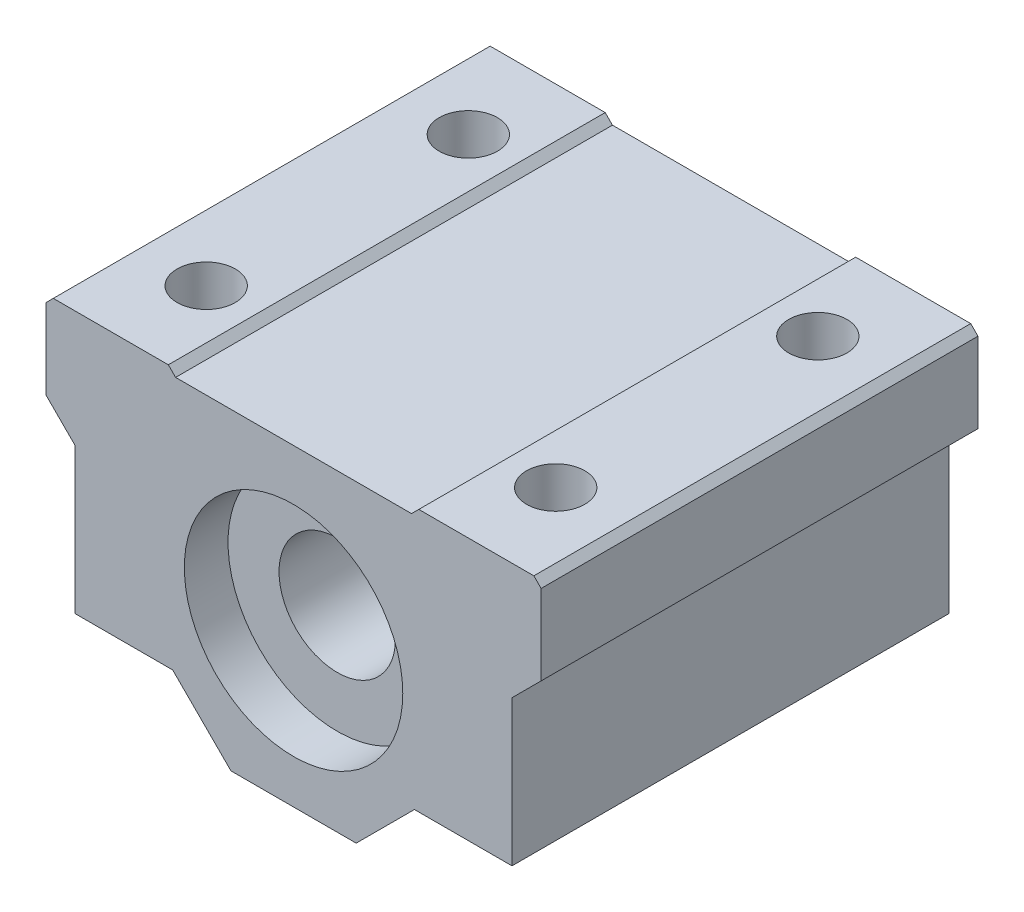
ISO-10303-21;
HEADER;
FILE_DESCRIPTION(('STEP AP214'),'2;1');
FILE_NAME('part.step','',(''),(''),'','','');
FILE_SCHEMA(('AUTOMOTIVE_DESIGN { 1 0 10303 214 1 1 1 1 }'));
ENDSEC;
DATA;
#1=APPLICATION_CONTEXT('core data for automotive mechanical design processes');
#2=APPLICATION_PROTOCOL_DEFINITION('international standard','automotive_design',2000,#1);
#3=PRODUCT_CONTEXT('',#1,'mechanical');
#4=PRODUCT('Part','Part','',(#3));
#5=PRODUCT_RELATED_PRODUCT_CATEGORY('part','',(#4));
#6=PRODUCT_DEFINITION_FORMATION('','',#4);
#7=PRODUCT_DEFINITION_CONTEXT('part definition',#1,'design');
#8=PRODUCT_DEFINITION('design','',#6,#7);
#9=PRODUCT_DEFINITION_SHAPE('','',#8);
#10=(LENGTH_UNIT() NAMED_UNIT(*) SI_UNIT(.MILLI.,.METRE.));
#11=(NAMED_UNIT(*) PLANE_ANGLE_UNIT() SI_UNIT($,.RADIAN.));
#12=(NAMED_UNIT(*) SI_UNIT($,.STERADIAN.) SOLID_ANGLE_UNIT());
#13=UNCERTAINTY_MEASURE_WITH_UNIT(LENGTH_MEASURE(1.E-05),#10,'distance_accuracy_value','');
#14=(GEOMETRIC_REPRESENTATION_CONTEXT(3) GLOBAL_UNCERTAINTY_ASSIGNED_CONTEXT((#13)) GLOBAL_UNIT_ASSIGNED_CONTEXT((#10,
#11,#12)) REPRESENTATION_CONTEXT('',''));
#15=CARTESIAN_POINT('',(0.,0.,0.));
#16=DIRECTION('',(0.,0.,1.));
#17=DIRECTION('',(1.,0.,0.));
#18=AXIS2_PLACEMENT_3D('',#15,#16,#17);
#19=CARTESIAN_POINT('',(-7.5,76.5,27.));
#20=DIRECTION('',(0.,0.,-1.));
#21=DIRECTION('',(1.,0.,0.));
#22=AXIS2_PLACEMENT_3D('',#19,#20,#21);
#23=PLANE('',#22);
#24=CARTESIAN_POINT('',(0.,69.,27.));
#25=DIRECTION('',(0.,0.,1.));
#26=DIRECTION('',(1.,0.,0.));
#27=AXIS2_PLACEMENT_3D('',#24,#25,#26);
#28=CIRCLE('',#27,4.);
#29=CARTESIAN_POINT('',(4.,69.,27.));
#30=VERTEX_POINT('',#29);
#31=EDGE_CURVE('E352',#30,#30,#28,.F.);
#32=ORIENTED_EDGE('',*,*,#31,.T.);
#33=EDGE_LOOP('',(#32));
#34=FACE_BOUND('',#33,.T.);
#35=CARTESIAN_POINT('',(0.,69.,27.));
#36=DIRECTION('',(0.,0.,1.));
#37=DIRECTION('',(1.,0.,0.));
#38=AXIS2_PLACEMENT_3D('',#35,#36,#37);
#39=CIRCLE('',#38,7.5);
#40=CARTESIAN_POINT('',(7.5,69.,27.));
#41=VERTEX_POINT('',#40);
#42=EDGE_CURVE('E19',#41,#41,#39,.T.);
#43=ORIENTED_EDGE('',*,*,#42,.T.);
#44=EDGE_LOOP('',(#43));
#45=FACE_BOUND('',#44,.T.);
#46=ADVANCED_FACE('F15',(#34,#45),#23,.F.);
#47=CARTESIAN_POINT('',(10.,72.5,8.));
#48=DIRECTION('',(0.,-1.,0.));
#49=DIRECTION('',(0.,0.,-1.));
#50=AXIS2_PLACEMENT_3D('',#47,#48,#49);
#51=PLANE('',#50);
#52=CARTESIAN_POINT('',(12.,72.5,6.));
#53=DIRECTION('',(0.,-1.,0.));
#54=DIRECTION('',(0.,0.,-1.));
#55=AXIS2_PLACEMENT_3D('',#52,#53,#54);
#56=CIRCLE('',#55,1.7);
#57=CARTESIAN_POINT('',(12.,72.5,4.3));
#58=VERTEX_POINT('',#57);
#59=EDGE_CURVE('E339',#58,#58,#56,.T.);
#60=ORIENTED_EDGE('',*,*,#59,.T.);
#61=EDGE_LOOP('',(#60));
#62=FACE_BOUND('',#61,.T.);
#63=CARTESIAN_POINT('',(12.,72.5,6.));
#64=DIRECTION('',(0.,-1.,0.));
#65=DIRECTION('',(0.,0.,-1.));
#66=AXIS2_PLACEMENT_3D('',#63,#64,#65);
#67=CIRCLE('',#66,2.);
#68=CARTESIAN_POINT('',(12.,72.5,4.));
#69=VERTEX_POINT('',#68);
#70=EDGE_CURVE('E348',#69,#69,#67,.F.);
#71=ORIENTED_EDGE('',*,*,#70,.T.);
#72=EDGE_LOOP('',(#71));
#73=FACE_BOUND('',#72,.T.);
#74=ADVANCED_FACE('F813',(#62,#73),#51,.F.);
#75=CARTESIAN_POINT('',(10.,72.5,26.));
#76=DIRECTION('',(0.,-1.,0.));
#77=DIRECTION('',(0.,0.,-1.));
#78=AXIS2_PLACEMENT_3D('',#75,#76,#77);
#79=PLANE('',#78);
#80=CARTESIAN_POINT('',(12.,72.5,24.));
#81=DIRECTION('',(0.,-1.,0.));
#82=DIRECTION('',(0.,0.,-1.));
#83=AXIS2_PLACEMENT_3D('',#80,#81,#82);
#84=CIRCLE('',#83,1.7);
#85=CARTESIAN_POINT('',(12.,72.5,22.3));
#86=VERTEX_POINT('',#85);
#87=EDGE_CURVE('E335',#86,#86,#84,.T.);
#88=ORIENTED_EDGE('',*,*,#87,.T.);
#89=EDGE_LOOP('',(#88));
#90=FACE_BOUND('',#89,.T.);
#91=CARTESIAN_POINT('',(12.,72.5,24.));
#92=DIRECTION('',(0.,-1.,0.));
#93=DIRECTION('',(0.,0.,-1.));
#94=AXIS2_PLACEMENT_3D('',#91,#92,#93);
#95=CIRCLE('',#94,2.);
#96=CARTESIAN_POINT('',(12.,72.5,22.));
#97=VERTEX_POINT('',#96);
#98=EDGE_CURVE('E344',#97,#97,#95,.F.);
#99=ORIENTED_EDGE('',*,*,#98,.T.);
#100=EDGE_LOOP('',(#99));
#101=FACE_BOUND('',#100,.T.);
#102=ADVANCED_FACE('F803',(#90,#101),#79,.F.);
#103=CARTESIAN_POINT('',(-14.,72.5,8.));
#104=DIRECTION('',(0.,-1.,0.));
#105=DIRECTION('',(0.,0.,-1.));
#106=AXIS2_PLACEMENT_3D('',#103,#104,#105);
#107=PLANE('',#106);
#108=CARTESIAN_POINT('',(-12.,72.5,6.));
#109=DIRECTION('',(0.,-1.,0.));
#110=DIRECTION('',(0.,0.,-1.));
#111=AXIS2_PLACEMENT_3D('',#108,#109,#110);
#112=CIRCLE('',#111,1.7);
#113=CARTESIAN_POINT('',(-12.,72.5,4.3));
#114=VERTEX_POINT('',#113);
#115=EDGE_CURVE('E331',#114,#114,#112,.T.);
#116=ORIENTED_EDGE('',*,*,#115,.T.);
#117=EDGE_LOOP('',(#116));
#118=FACE_BOUND('',#117,.T.);
#119=CARTESIAN_POINT('',(-12.,72.5,6.));
#120=DIRECTION('',(0.,-1.,0.));
#121=DIRECTION('',(0.,0.,-1.));
#122=AXIS2_PLACEMENT_3D('',#119,#120,#121);
#123=CIRCLE('',#122,2.);
#124=CARTESIAN_POINT('',(-12.,72.5,4.));
#125=VERTEX_POINT('',#124);
#126=EDGE_CURVE('E322',#125,#125,#123,.F.);
#127=ORIENTED_EDGE('',*,*,#126,.T.);
#128=EDGE_LOOP('',(#127));
#129=FACE_BOUND('',#128,.T.);
#130=ADVANCED_FACE('F793',(#118,#129),#107,.F.);
#131=CARTESIAN_POINT('',(-14.,72.5,26.));
#132=DIRECTION('',(0.,-1.,0.));
#133=DIRECTION('',(0.,0.,-1.));
#134=AXIS2_PLACEMENT_3D('',#131,#132,#133);
#135=PLANE('',#134);
#136=CARTESIAN_POINT('',(-12.,72.5,24.));
#137=DIRECTION('',(0.,-1.,0.));
#138=DIRECTION('',(0.,0.,-1.));
#139=AXIS2_PLACEMENT_3D('',#136,#137,#138);
#140=CIRCLE('',#139,1.7);
#141=CARTESIAN_POINT('',(-12.,72.5,22.3));
#142=VERTEX_POINT('',#141);
#143=EDGE_CURVE('E327',#142,#142,#140,.T.);
#144=ORIENTED_EDGE('',*,*,#143,.T.);
#145=EDGE_LOOP('',(#144));
#146=FACE_BOUND('',#145,.T.);
#147=CARTESIAN_POINT('',(-12.,72.5,24.));
#148=DIRECTION('',(0.,-1.,0.));
#149=DIRECTION('',(0.,0.,-1.));
#150=AXIS2_PLACEMENT_3D('',#147,#148,#149);
#151=CIRCLE('',#150,2.);
#152=CARTESIAN_POINT('',(-12.,72.5,22.));
#153=VERTEX_POINT('',#152);
#154=EDGE_CURVE('E318',#153,#153,#151,.F.);
#155=ORIENTED_EDGE('',*,*,#154,.T.);
#156=EDGE_LOOP('',(#155));
#157=FACE_BOUND('',#156,.T.);
#158=ADVANCED_FACE('F368',(#146,#157),#135,.F.);
#159=CARTESIAN_POINT('',(0.,69.,27.));
#160=DIRECTION('',(0.,0.,1.));
#161=DIRECTION('',(1.,0.,0.));
#162=AXIS2_PLACEMENT_3D('',#159,#160,#161);
#163=CYLINDRICAL_SURFACE('',#162,7.5);
#164=ORIENTED_EDGE('',*,*,#42,.F.);
#165=EDGE_LOOP('',(#164));
#166=FACE_BOUND('',#165,.T.);
#167=CARTESIAN_POINT('',(0.,69.,30.));
#168=DIRECTION('',(0.,0.,1.));
#169=DIRECTION('',(1.,0.,0.));
#170=AXIS2_PLACEMENT_3D('',#167,#168,#169);
#171=CIRCLE('',#170,7.5);
#172=CARTESIAN_POINT('',(7.5,69.,30.));
#173=VERTEX_POINT('',#172);
#174=EDGE_CURVE('E306',#173,#173,#171,.T.);
#175=ORIENTED_EDGE('',*,*,#174,.T.);
#176=EDGE_LOOP('',(#175));
#177=FACE_BOUND('',#176,.T.);
#178=ADVANCED_FACE('F364',(#166,#177),#163,.F.);
#179=CARTESIAN_POINT('',(0.,69.,3.));
#180=DIRECTION('',(0.,0.,1.));
#181=DIRECTION('',(1.,0.,0.));
#182=AXIS2_PLACEMENT_3D('',#179,#180,#181);
#183=CYLINDRICAL_SURFACE('',#182,4.);
#184=ORIENTED_EDGE('',*,*,#31,.F.);
#185=EDGE_LOOP('',(#184));
#186=FACE_BOUND('',#185,.T.);
#187=CARTESIAN_POINT('',(0.,69.,3.));
#188=DIRECTION('',(0.,0.,1.));
#189=DIRECTION('',(1.,0.,0.));
#190=AXIS2_PLACEMENT_3D('',#187,#188,#189);
#191=CIRCLE('',#190,4.);
#192=CARTESIAN_POINT('',(4.,69.,3.));
#193=VERTEX_POINT('',#192);
#194=EDGE_CURVE('E173',#193,#193,#191,.F.);
#195=ORIENTED_EDGE('',*,*,#194,.T.);
#196=EDGE_LOOP('',(#195));
#197=FACE_BOUND('',#196,.T.);
#198=ADVANCED_FACE('F367',(#186,#197),#183,.F.);
#199=CARTESIAN_POINT('',(8.6,80.5,0.));
#200=DIRECTION('',(-0.707106781186547,0.707106781186547,0.));
#201=DIRECTION('',(-0.707106781186547,-0.707106781186547,0.));
#202=AXIS2_PLACEMENT_3D('',#199,#200,#201);
#203=PLANE('',#202);
#204=DIRECTION('',(-0.707106781186547,-0.707106781186547,0.));
#205=VECTOR('',#204,1.);
#206=CARTESIAN_POINT('',(8.6,80.5,30.));
#207=LINE('',#206,#205);
#208=CARTESIAN_POINT('',(8.1,80.,30.));
#209=VERTEX_POINT('',#208);
#210=CARTESIAN_POINT('',(8.6,80.5,30.));
#211=VERTEX_POINT('',#210);
#212=EDGE_CURVE('E144',#209,#211,#207,.F.);
#213=ORIENTED_EDGE('',*,*,#212,.T.);
#214=DIRECTION('',(0.,0.,1.));
#215=VECTOR('',#214,1.);
#216=CARTESIAN_POINT('',(8.6,80.5,15.));
#217=LINE('',#216,#215);
#218=CARTESIAN_POINT('',(8.6,80.5,0.));
#219=VERTEX_POINT('',#218);
#220=EDGE_CURVE('E148',#219,#211,#217,.T.);
#221=ORIENTED_EDGE('',*,*,#220,.F.);
#222=DIRECTION('',(-0.707106781186547,-0.707106781186547,0.));
#223=VECTOR('',#222,1.);
#224=CARTESIAN_POINT('',(8.35,80.25,0.));
#225=LINE('',#224,#223);
#226=CARTESIAN_POINT('',(8.1,80.,0.));
#227=VERTEX_POINT('',#226);
#228=EDGE_CURVE('E351',#219,#227,#225,.T.);
#229=ORIENTED_EDGE('',*,*,#228,.T.);
#230=DIRECTION('',(0.,0.,-1.));
#231=VECTOR('',#230,1.);
#232=CARTESIAN_POINT('',(8.1,80.,15.));
#233=LINE('',#232,#231);
#234=EDGE_CURVE('E150',#209,#227,#233,.T.);
#235=ORIENTED_EDGE('',*,*,#234,.F.);
#236=EDGE_LOOP('',(#213,#221,#229,#235));
#237=FACE_BOUND('',#236,.T.);
#238=ADVANCED_FACE('F146',(#237),#203,.T.);
#239=CARTESIAN_POINT('',(12.,80.5,6.));
#240=DIRECTION('',(0.,-1.,0.));
#241=DIRECTION('',(0.,0.,-1.));
#242=AXIS2_PLACEMENT_3D('',#239,#240,#241);
#243=CYLINDRICAL_SURFACE('',#242,2.);
#244=ORIENTED_EDGE('',*,*,#70,.F.);
#245=EDGE_LOOP('',(#244));
#246=FACE_BOUND('',#245,.T.);
#247=CARTESIAN_POINT('',(12.,80.5,6.));
#248=DIRECTION('',(0.,-1.,0.));
#249=DIRECTION('',(0.,0.,-1.));
#250=AXIS2_PLACEMENT_3D('',#247,#248,#249);
#251=CIRCLE('',#250,2.);
#252=CARTESIAN_POINT('',(12.,80.5,4.));
#253=VERTEX_POINT('',#252);
#254=EDGE_CURVE('E299',#253,#253,#251,.T.);
#255=ORIENTED_EDGE('',*,*,#254,.F.);
#256=EDGE_LOOP('',(#255));
#257=FACE_BOUND('',#256,.T.);
#258=ADVANCED_FACE('F751',(#246,#257),#243,.F.);
#259=CARTESIAN_POINT('',(12.,80.5,24.));
#260=DIRECTION('',(0.,-1.,0.));
#261=DIRECTION('',(0.,0.,-1.));
#262=AXIS2_PLACEMENT_3D('',#259,#260,#261);
#263=CYLINDRICAL_SURFACE('',#262,2.);
#264=ORIENTED_EDGE('',*,*,#98,.F.);
#265=EDGE_LOOP('',(#264));
#266=FACE_BOUND('',#265,.T.);
#267=CARTESIAN_POINT('',(12.,80.5,24.));
#268=DIRECTION('',(0.,-1.,0.));
#269=DIRECTION('',(0.,0.,-1.));
#270=AXIS2_PLACEMENT_3D('',#267,#268,#269);
#271=CIRCLE('',#270,2.);
#272=CARTESIAN_POINT('',(12.,80.5,22.));
#273=VERTEX_POINT('',#272);
#274=EDGE_CURVE('E294',#273,#273,#271,.T.);
#275=ORIENTED_EDGE('',*,*,#274,.F.);
#276=EDGE_LOOP('',(#275));
#277=FACE_BOUND('',#276,.T.);
#278=ADVANCED_FACE('F742',(#266,#277),#263,.F.);
#279=CARTESIAN_POINT('',(17.,80.,0.));
#280=DIRECTION('',(0.707106781186547,0.707106781186547,0.));
#281=DIRECTION('',(-0.707106781186547,0.707106781186547,0.));
#282=AXIS2_PLACEMENT_3D('',#279,#280,#281);
#283=PLANE('',#282);
#284=DIRECTION('',(-0.707106781186547,0.707106781186547,0.));
#285=VECTOR('',#284,1.);
#286=CARTESIAN_POINT('',(17.,80.,30.));
#287=LINE('',#286,#285);
#288=CARTESIAN_POINT('',(16.5,80.5,30.));
#289=VERTEX_POINT('',#288);
#290=CARTESIAN_POINT('',(17.,80.,30.));
#291=VERTEX_POINT('',#290);
#292=EDGE_CURVE('E153',#289,#291,#287,.F.);
#293=ORIENTED_EDGE('',*,*,#292,.T.);
#294=DIRECTION('',(0.,0.,1.));
#295=VECTOR('',#294,1.);
#296=CARTESIAN_POINT('',(17.,80.,15.));
#297=LINE('',#296,#295);
#298=CARTESIAN_POINT('',(17.,80.,0.));
#299=VERTEX_POINT('',#298);
#300=EDGE_CURVE('E298',#299,#291,#297,.T.);
#301=ORIENTED_EDGE('',*,*,#300,.F.);
#302=DIRECTION('',(-0.707106781186547,0.707106781186547,0.));
#303=VECTOR('',#302,1.);
#304=CARTESIAN_POINT('',(16.75,80.25,0.));
#305=LINE('',#304,#303);
#306=CARTESIAN_POINT('',(16.5,80.5,0.));
#307=VERTEX_POINT('',#306);
#308=EDGE_CURVE('E343',#299,#307,#305,.T.);
#309=ORIENTED_EDGE('',*,*,#308,.T.);
#310=DIRECTION('',(0.,0.,-1.));
#311=VECTOR('',#310,1.);
#312=CARTESIAN_POINT('',(16.5,80.5,15.));
#313=LINE('',#312,#311);
#314=EDGE_CURVE('E164',#289,#307,#313,.T.);
#315=ORIENTED_EDGE('',*,*,#314,.F.);
#316=EDGE_LOOP('',(#293,#301,#309,#315));
#317=FACE_BOUND('',#316,.T.);
#318=ADVANCED_FACE('F430',(#317),#283,.T.);
#319=CARTESIAN_POINT('',(12.,72.5,6.));
#320=DIRECTION('',(0.,-1.,0.));
#321=DIRECTION('',(0.,0.,-1.));
#322=AXIS2_PLACEMENT_3D('',#319,#320,#321);
#323=CYLINDRICAL_SURFACE('',#322,1.7);
#324=ORIENTED_EDGE('',*,*,#59,.F.);
#325=EDGE_LOOP('',(#324));
#326=FACE_BOUND('',#325,.T.);
#327=CARTESIAN_POINT('',(12.,62.5,6.));
#328=DIRECTION('',(0.,-1.,0.));
#329=DIRECTION('',(0.,0.,-1.));
#330=AXIS2_PLACEMENT_3D('',#327,#328,#329);
#331=CIRCLE('',#330,1.7);
#332=CARTESIAN_POINT('',(12.,62.5,4.3));
#333=VERTEX_POINT('',#332);
#334=EDGE_CURVE('E289',#333,#333,#331,.F.);
#335=ORIENTED_EDGE('',*,*,#334,.F.);
#336=EDGE_LOOP('',(#335));
#337=FACE_BOUND('',#336,.T.);
#338=ADVANCED_FACE('F723',(#326,#337),#323,.F.);
#339=CARTESIAN_POINT('',(12.,72.5,24.));
#340=DIRECTION('',(0.,-1.,0.));
#341=DIRECTION('',(0.,0.,-1.));
#342=AXIS2_PLACEMENT_3D('',#339,#340,#341);
#343=CYLINDRICAL_SURFACE('',#342,1.7);
#344=ORIENTED_EDGE('',*,*,#87,.F.);
#345=EDGE_LOOP('',(#344));
#346=FACE_BOUND('',#345,.T.);
#347=CARTESIAN_POINT('',(12.,62.5,24.));
#348=DIRECTION('',(0.,-1.,0.));
#349=DIRECTION('',(0.,0.,-1.));
#350=AXIS2_PLACEMENT_3D('',#347,#348,#349);
#351=CIRCLE('',#350,1.7);
#352=CARTESIAN_POINT('',(12.,62.5,22.3));
#353=VERTEX_POINT('',#352);
#354=EDGE_CURVE('E203',#353,#353,#351,.F.);
#355=ORIENTED_EDGE('',*,*,#354,.F.);
#356=EDGE_LOOP('',(#355));
#357=FACE_BOUND('',#356,.T.);
#358=ADVANCED_FACE('F713',(#346,#357),#343,.F.);
#359=CARTESIAN_POINT('',(-12.,72.5,6.));
#360=DIRECTION('',(0.,-1.,0.));
#361=DIRECTION('',(0.,0.,-1.));
#362=AXIS2_PLACEMENT_3D('',#359,#360,#361);
#363=CYLINDRICAL_SURFACE('',#362,1.7);
#364=ORIENTED_EDGE('',*,*,#115,.F.);
#365=EDGE_LOOP('',(#364));
#366=FACE_BOUND('',#365,.T.);
#367=CARTESIAN_POINT('',(-12.,62.5,6.));
#368=DIRECTION('',(0.,-1.,0.));
#369=DIRECTION('',(0.,0.,-1.));
#370=AXIS2_PLACEMENT_3D('',#367,#368,#369);
#371=CIRCLE('',#370,1.7);
#372=CARTESIAN_POINT('',(-12.,62.5,4.3));
#373=VERTEX_POINT('',#372);
#374=EDGE_CURVE('E282',#373,#373,#371,.F.);
#375=ORIENTED_EDGE('',*,*,#374,.F.);
#376=EDGE_LOOP('',(#375));
#377=FACE_BOUND('',#376,.T.);
#378=ADVANCED_FACE('F703',(#366,#377),#363,.F.);
#379=CARTESIAN_POINT('',(-12.,72.5,24.));
#380=DIRECTION('',(0.,-1.,0.));
#381=DIRECTION('',(0.,0.,-1.));
#382=AXIS2_PLACEMENT_3D('',#379,#380,#381);
#383=CYLINDRICAL_SURFACE('',#382,1.7);
#384=ORIENTED_EDGE('',*,*,#143,.F.);
#385=EDGE_LOOP('',(#384));
#386=FACE_BOUND('',#385,.T.);
#387=CARTESIAN_POINT('',(-12.,62.5,24.));
#388=DIRECTION('',(0.,-1.,0.));
#389=DIRECTION('',(0.,0.,-1.));
#390=AXIS2_PLACEMENT_3D('',#387,#388,#389);
#391=CIRCLE('',#390,1.7);
#392=CARTESIAN_POINT('',(-12.,62.5,22.3));
#393=VERTEX_POINT('',#392);
#394=EDGE_CURVE('E277',#393,#393,#391,.F.);
#395=ORIENTED_EDGE('',*,*,#394,.F.);
#396=EDGE_LOOP('',(#395));
#397=FACE_BOUND('',#396,.T.);
#398=ADVANCED_FACE('F694',(#386,#397),#383,.F.);
#399=CARTESIAN_POINT('',(-16.5,80.5,0.));
#400=DIRECTION('',(-0.707106781186547,0.707106781186547,0.));
#401=DIRECTION('',(-0.707106781186547,-0.707106781186547,0.));
#402=AXIS2_PLACEMENT_3D('',#399,#400,#401);
#403=PLANE('',#402);
#404=DIRECTION('',(-0.707106781186547,-0.707106781186547,0.));
#405=VECTOR('',#404,1.);
#406=CARTESIAN_POINT('',(-16.5,80.5,30.));
#407=LINE('',#406,#405);
#408=CARTESIAN_POINT('',(-17.,80.,30.));
#409=VERTEX_POINT('',#408);
#410=CARTESIAN_POINT('',(-16.5,80.5,30.));
#411=VERTEX_POINT('',#410);
#412=EDGE_CURVE('E313',#409,#411,#407,.F.);
#413=ORIENTED_EDGE('',*,*,#412,.T.);
#414=DIRECTION('',(0.,0.,1.));
#415=VECTOR('',#414,1.);
#416=CARTESIAN_POINT('',(-16.5,80.5,15.));
#417=LINE('',#416,#415);
#418=CARTESIAN_POINT('',(-16.5,80.5,0.));
#419=VERTEX_POINT('',#418);
#420=EDGE_CURVE('E411',#419,#411,#417,.T.);
#421=ORIENTED_EDGE('',*,*,#420,.F.);
#422=DIRECTION('',(-0.707106781186547,-0.707106781186547,0.));
#423=VECTOR('',#422,1.);
#424=CARTESIAN_POINT('',(-16.75,80.25,0.));
#425=LINE('',#424,#423);
#426=CARTESIAN_POINT('',(-17.,80.,0.));
#427=VERTEX_POINT('',#426);
#428=EDGE_CURVE('E326',#419,#427,#425,.T.);
#429=ORIENTED_EDGE('',*,*,#428,.T.);
#430=DIRECTION('',(0.,0.,-1.));
#431=VECTOR('',#430,1.);
#432=CARTESIAN_POINT('',(-17.,80.,15.));
#433=LINE('',#432,#431);
#434=EDGE_CURVE('E407',#409,#427,#433,.T.);
#435=ORIENTED_EDGE('',*,*,#434,.F.);
#436=EDGE_LOOP('',(#413,#421,#429,#435));
#437=FACE_BOUND('',#436,.T.);
#438=ADVANCED_FACE('F454',(#437),#403,.T.);
#439=CARTESIAN_POINT('',(-12.,80.5,6.));
#440=DIRECTION('',(0.,-1.,0.));
#441=DIRECTION('',(0.,0.,-1.));
#442=AXIS2_PLACEMENT_3D('',#439,#440,#441);
#443=CYLINDRICAL_SURFACE('',#442,2.);
#444=ORIENTED_EDGE('',*,*,#126,.F.);
#445=EDGE_LOOP('',(#444));
#446=FACE_BOUND('',#445,.T.);
#447=CARTESIAN_POINT('',(-12.,80.5,6.));
#448=DIRECTION('',(0.,-1.,0.));
#449=DIRECTION('',(0.,0.,-1.));
#450=AXIS2_PLACEMENT_3D('',#447,#448,#449);
#451=CIRCLE('',#450,2.);
#452=CARTESIAN_POINT('',(-12.,80.5,4.));
#453=VERTEX_POINT('',#452);
#454=EDGE_CURVE('E272',#453,#453,#451,.T.);
#455=ORIENTED_EDGE('',*,*,#454,.F.);
#456=EDGE_LOOP('',(#455));
#457=FACE_BOUND('',#456,.T.);
#458=ADVANCED_FACE('F675',(#446,#457),#443,.F.);
#459=CARTESIAN_POINT('',(-12.,80.5,24.));
#460=DIRECTION('',(0.,-1.,0.));
#461=DIRECTION('',(0.,0.,-1.));
#462=AXIS2_PLACEMENT_3D('',#459,#460,#461);
#463=CYLINDRICAL_SURFACE('',#462,2.);
#464=ORIENTED_EDGE('',*,*,#154,.F.);
#465=EDGE_LOOP('',(#464));
#466=FACE_BOUND('',#465,.T.);
#467=CARTESIAN_POINT('',(-12.,80.5,24.));
#468=DIRECTION('',(0.,-1.,0.));
#469=DIRECTION('',(0.,0.,-1.));
#470=AXIS2_PLACEMENT_3D('',#467,#468,#469);
#471=CIRCLE('',#470,2.);
#472=CARTESIAN_POINT('',(-12.,80.5,22.));
#473=VERTEX_POINT('',#472);
#474=EDGE_CURVE('E267',#473,#473,#471,.T.);
#475=ORIENTED_EDGE('',*,*,#474,.F.);
#476=EDGE_LOOP('',(#475));
#477=FACE_BOUND('',#476,.T.);
#478=ADVANCED_FACE('F382',(#466,#477),#463,.F.);
#479=CARTESIAN_POINT('',(-8.1,80.,0.));
#480=DIRECTION('',(0.707106781186547,0.707106781186547,0.));
#481=DIRECTION('',(-0.707106781186547,0.707106781186547,0.));
#482=AXIS2_PLACEMENT_3D('',#479,#480,#481);
#483=PLANE('',#482);
#484=DIRECTION('',(-0.707106781186547,0.707106781186547,0.));
#485=VECTOR('',#484,1.);
#486=CARTESIAN_POINT('',(-8.1,80.,30.));
#487=LINE('',#486,#485);
#488=CARTESIAN_POINT('',(-8.6,80.5,30.));
#489=VERTEX_POINT('',#488);
#490=CARTESIAN_POINT('',(-8.1,80.,30.));
#491=VERTEX_POINT('',#490);
#492=EDGE_CURVE('E310',#489,#491,#487,.F.);
#493=ORIENTED_EDGE('',*,*,#492,.T.);
#494=DIRECTION('',(0.,0.,1.));
#495=VECTOR('',#494,1.);
#496=CARTESIAN_POINT('',(-8.1,80.,15.));
#497=LINE('',#496,#495);
#498=CARTESIAN_POINT('',(-8.1,80.,0.));
#499=VERTEX_POINT('',#498);
#500=EDGE_CURVE('E271',#499,#491,#497,.T.);
#501=ORIENTED_EDGE('',*,*,#500,.F.);
#502=DIRECTION('',(-0.707106781186547,0.707106781186547,0.));
#503=VECTOR('',#502,1.);
#504=CARTESIAN_POINT('',(-8.35,80.25,0.));
#505=LINE('',#504,#503);
#506=CARTESIAN_POINT('',(-8.6,80.5,0.));
#507=VERTEX_POINT('',#506);
#508=EDGE_CURVE('E154',#499,#507,#505,.T.);
#509=ORIENTED_EDGE('',*,*,#508,.T.);
#510=DIRECTION('',(0.,0.,-1.));
#511=VECTOR('',#510,1.);
#512=CARTESIAN_POINT('',(-8.6,80.5,15.));
#513=LINE('',#512,#511);
#514=EDGE_CURVE('E276',#489,#507,#513,.T.);
#515=ORIENTED_EDGE('',*,*,#514,.F.);
#516=EDGE_LOOP('',(#493,#501,#509,#515));
#517=FACE_BOUND('',#516,.T.);
#518=ADVANCED_FACE('F374',(#517),#483,.T.);
#519=CARTESIAN_POINT('',(-17.,80.5,30.));
#520=DIRECTION('',(0.,0.,-1.));
#521=DIRECTION('',(1.,0.,0.));
#522=AXIS2_PLACEMENT_3D('',#519,#520,#521);
#523=PLANE('',#522);
#524=ORIENTED_EDGE('',*,*,#174,.F.);
#525=EDGE_LOOP('',(#524));
#526=FACE_BOUND('',#525,.T.);
#527=ORIENTED_EDGE('',*,*,#492,.F.);
#528=DIRECTION('',(1.,0.,0.));
#529=VECTOR('',#528,1.);
#530=CARTESIAN_POINT('',(-12.55,80.5,30.));
#531=LINE('',#530,#529);
#532=EDGE_CURVE('E418',#411,#489,#531,.T.);
#533=ORIENTED_EDGE('',*,*,#532,.F.);
#534=ORIENTED_EDGE('',*,*,#412,.F.);
#535=DIRECTION('',(0.,1.,0.));
#536=VECTOR('',#535,1.);
#537=CARTESIAN_POINT('',(-17.,77.25,30.));
#538=LINE('',#537,#536);
#539=CARTESIAN_POINT('',(-17.,74.5,30.));
#540=VERTEX_POINT('',#539);
#541=EDGE_CURVE('E246',#540,#409,#538,.T.);
#542=ORIENTED_EDGE('',*,*,#541,.F.);
#543=DIRECTION('',(-0.707106781186547,0.707106781186547,0.));
#544=VECTOR('',#543,1.);
#545=CARTESIAN_POINT('',(-16.,73.5,30.));
#546=LINE('',#545,#544);
#547=CARTESIAN_POINT('',(-15.,72.5,30.));
#548=VERTEX_POINT('',#547);
#549=EDGE_CURVE('E236',#548,#540,#546,.T.);
#550=ORIENTED_EDGE('',*,*,#549,.F.);
#551=DIRECTION('',(0.,1.,0.));
#552=VECTOR('',#551,1.);
#553=CARTESIAN_POINT('',(-15.,67.5,30.));
#554=LINE('',#553,#552);
#555=CARTESIAN_POINT('',(-15.,62.5,30.));
#556=VERTEX_POINT('',#555);
#557=EDGE_CURVE('E237',#556,#548,#554,.T.);
#558=ORIENTED_EDGE('',*,*,#557,.F.);
#559=DIRECTION('',(-1.,0.,0.));
#560=VECTOR('',#559,1.);
#561=CARTESIAN_POINT('',(-11.65,62.5,30.));
#562=LINE('',#561,#560);
#563=CARTESIAN_POINT('',(-8.3,62.5,30.));
#564=VERTEX_POINT('',#563);
#565=EDGE_CURVE('E226',#564,#556,#562,.T.);
#566=ORIENTED_EDGE('',*,*,#565,.F.);
#567=DIRECTION('',(-0.707106781186548,0.707106781186547,0.));
#568=VECTOR('',#567,1.);
#569=CARTESIAN_POINT('',(-6.3,60.5,30.));
#570=LINE('',#569,#568);
#571=CARTESIAN_POINT('',(-4.3,58.5,30.));
#572=VERTEX_POINT('',#571);
#573=EDGE_CURVE('E221',#572,#564,#570,.T.);
#574=ORIENTED_EDGE('',*,*,#573,.F.);
#575=DIRECTION('',(-1.,0.,0.));
#576=VECTOR('',#575,1.);
#577=CARTESIAN_POINT('',(-2.15,58.5,30.));
#578=LINE('',#577,#576);
#579=CARTESIAN_POINT('',(4.3,58.5,30.));
#580=VERTEX_POINT('',#579);
#581=EDGE_CURVE('E212',#580,#572,#578,.T.);
#582=ORIENTED_EDGE('',*,*,#581,.F.);
#583=DIRECTION('',(-0.707106781186548,-0.707106781186547,0.));
#584=VECTOR('',#583,1.);
#585=CARTESIAN_POINT('',(6.3,60.5,30.));
#586=LINE('',#585,#584);
#587=CARTESIAN_POINT('',(8.3,62.5,30.));
#588=VERTEX_POINT('',#587);
#589=EDGE_CURVE('E202',#588,#580,#586,.T.);
#590=ORIENTED_EDGE('',*,*,#589,.F.);
#591=DIRECTION('',(-1.,0.,0.));
#592=VECTOR('',#591,1.);
#593=CARTESIAN_POINT('',(11.65,62.5,30.));
#594=LINE('',#593,#592);
#595=CARTESIAN_POINT('',(15.,62.5,30.));
#596=VERTEX_POINT('',#595);
#597=EDGE_CURVE('E293',#596,#588,#594,.T.);
#598=ORIENTED_EDGE('',*,*,#597,.F.);
#599=DIRECTION('',(0.,-1.,0.));
#600=VECTOR('',#599,1.);
#601=CARTESIAN_POINT('',(15.,67.5,30.));
#602=LINE('',#601,#600);
#603=CARTESIAN_POINT('',(15.,72.5,30.));
#604=VERTEX_POINT('',#603);
#605=EDGE_CURVE('E192',#604,#596,#602,.T.);
#606=ORIENTED_EDGE('',*,*,#605,.F.);
#607=DIRECTION('',(-0.707106781186547,-0.707106781186547,0.));
#608=VECTOR('',#607,1.);
#609=CARTESIAN_POINT('',(16.,73.5,30.));
#610=LINE('',#609,#608);
#611=CARTESIAN_POINT('',(17.,74.5,30.));
#612=VERTEX_POINT('',#611);
#613=EDGE_CURVE('E181',#612,#604,#610,.T.);
#614=ORIENTED_EDGE('',*,*,#613,.F.);
#615=DIRECTION('',(0.,-1.,0.));
#616=VECTOR('',#615,1.);
#617=CARTESIAN_POINT('',(17.,77.25,30.));
#618=LINE('',#617,#616);
#619=EDGE_CURVE('E182',#291,#612,#618,.T.);
#620=ORIENTED_EDGE('',*,*,#619,.F.);
#621=ORIENTED_EDGE('',*,*,#292,.F.);
#622=DIRECTION('',(1.,0.,0.));
#623=VECTOR('',#622,1.);
#624=CARTESIAN_POINT('',(12.55,80.5,30.));
#625=LINE('',#624,#623);
#626=EDGE_CURVE('E157',#211,#289,#625,.T.);
#627=ORIENTED_EDGE('',*,*,#626,.F.);
#628=ORIENTED_EDGE('',*,*,#212,.F.);
#629=DIRECTION('',(1.,0.,0.));
#630=VECTOR('',#629,1.);
#631=CARTESIAN_POINT('',(-4.05,80.,30.));
#632=LINE('',#631,#630);
#633=EDGE_CURVE('E138',#491,#209,#632,.T.);
#634=ORIENTED_EDGE('',*,*,#633,.F.);
#635=EDGE_LOOP('',(#527,#533,#534,#542,#550,#558,#566,#574,#582,#590,#598,#606,#614,#620,#621,
#627,#628,#634));
#636=FACE_BOUND('',#635,.T.);
#637=ADVANCED_FACE('F158',(#526,#636),#523,.F.);
#638=CARTESIAN_POINT('',(-7.5,61.5,3.));
#639=DIRECTION('',(0.,0.,1.));
#640=DIRECTION('',(1.,0.,0.));
#641=AXIS2_PLACEMENT_3D('',#638,#639,#640);
#642=PLANE('',#641);
#643=ORIENTED_EDGE('',*,*,#194,.F.);
#644=EDGE_LOOP('',(#643));
#645=FACE_BOUND('',#644,.T.);
#646=CARTESIAN_POINT('',(0.,69.,3.));
#647=DIRECTION('',(0.,0.,1.));
#648=DIRECTION('',(1.,0.,0.));
#649=AXIS2_PLACEMENT_3D('',#646,#647,#648);
#650=CIRCLE('',#649,7.5);
#651=CARTESIAN_POINT('',(7.5,69.,3.));
#652=VERTEX_POINT('',#651);
#653=EDGE_CURVE('E263',#652,#652,#650,.F.);
#654=ORIENTED_EDGE('',*,*,#653,.T.);
#655=EDGE_LOOP('',(#654));
#656=FACE_BOUND('',#655,.T.);
#657=ADVANCED_FACE('F373',(#645,#656),#642,.F.);
#658=CARTESIAN_POINT('',(16.5,80.5,0.));
#659=DIRECTION('',(0.,1.,0.));
#660=DIRECTION('',(-1.,0.,0.));
#661=AXIS2_PLACEMENT_3D('',#658,#659,#660);
#662=PLANE('',#661);
#663=ORIENTED_EDGE('',*,*,#274,.T.);
#664=EDGE_LOOP('',(#663));
#665=FACE_BOUND('',#664,.T.);
#666=ORIENTED_EDGE('',*,*,#254,.T.);
#667=EDGE_LOOP('',(#666));
#668=FACE_BOUND('',#667,.T.);
#669=ORIENTED_EDGE('',*,*,#626,.T.);
#670=ORIENTED_EDGE('',*,*,#314,.T.);
#671=DIRECTION('',(1.,0.,0.));
#672=VECTOR('',#671,1.);
#673=CARTESIAN_POINT('',(0.,80.5,0.));
#674=LINE('',#673,#672);
#675=EDGE_CURVE('E168',#219,#307,#674,.T.);
#676=ORIENTED_EDGE('',*,*,#675,.F.);
#677=ORIENTED_EDGE('',*,*,#220,.T.);
#678=EDGE_LOOP('',(#669,#670,#676,#677));
#679=FACE_BOUND('',#678,.T.);
#680=ADVANCED_FACE('F166',(#665,#668,#679),#662,.T.);
#681=CARTESIAN_POINT('',(17.,74.5,0.));
#682=DIRECTION('',(1.,0.,0.));
#683=DIRECTION('',(0.,1.,0.));
#684=AXIS2_PLACEMENT_3D('',#681,#682,#683);
#685=PLANE('',#684);
#686=ORIENTED_EDGE('',*,*,#619,.T.);
#687=DIRECTION('',(0.,0.,1.));
#688=VECTOR('',#687,1.);
#689=CARTESIAN_POINT('',(17.,74.5,15.));
#690=LINE('',#689,#688);
#691=CARTESIAN_POINT('',(17.,74.5,0.));
#692=VERTEX_POINT('',#691);
#693=EDGE_CURVE('E177',#692,#612,#690,.T.);
#694=ORIENTED_EDGE('',*,*,#693,.F.);
#695=DIRECTION('',(0.,-1.,0.));
#696=VECTOR('',#695,1.);
#697=CARTESIAN_POINT('',(17.,69.5,0.));
#698=LINE('',#697,#696);
#699=EDGE_CURVE('E183',#299,#692,#698,.T.);
#700=ORIENTED_EDGE('',*,*,#699,.F.);
#701=ORIENTED_EDGE('',*,*,#300,.T.);
#702=EDGE_LOOP('',(#686,#694,#700,#701));
#703=FACE_BOUND('',#702,.T.);
#704=ADVANCED_FACE('F427',(#703),#685,.T.);
#705=CARTESIAN_POINT('',(15.,72.5,0.));
#706=DIRECTION('',(0.707106781186547,-0.707106781186547,0.));
#707=DIRECTION('',(0.707106781186547,0.707106781186547,0.));
#708=AXIS2_PLACEMENT_3D('',#705,#706,#707);
#709=PLANE('',#708);
#710=ORIENTED_EDGE('',*,*,#613,.T.);
#711=DIRECTION('',(0.,0.,1.));
#712=VECTOR('',#711,1.);
#713=CARTESIAN_POINT('',(15.,72.5,15.));
#714=LINE('',#713,#712);
#715=CARTESIAN_POINT('',(15.,72.5,0.));
#716=VERTEX_POINT('',#715);
#717=EDGE_CURVE('E188',#716,#604,#714,.T.);
#718=ORIENTED_EDGE('',*,*,#717,.F.);
#719=DIRECTION('',(-0.707106781186547,-0.707106781186547,0.));
#720=VECTOR('',#719,1.);
#721=CARTESIAN_POINT('',(17.,74.5,0.));
#722=LINE('',#721,#720);
#723=EDGE_CURVE('E187',#692,#716,#722,.T.);
#724=ORIENTED_EDGE('',*,*,#723,.F.);
#725=ORIENTED_EDGE('',*,*,#693,.T.);
#726=EDGE_LOOP('',(#710,#718,#724,#725));
#727=FACE_BOUND('',#726,.T.);
#728=ADVANCED_FACE('F437',(#727),#709,.T.);
#729=CARTESIAN_POINT('',(15.,62.5,0.));
#730=DIRECTION('',(1.,0.,0.));
#731=DIRECTION('',(0.,1.,0.));
#732=AXIS2_PLACEMENT_3D('',#729,#730,#731);
#733=PLANE('',#732);
#734=ORIENTED_EDGE('',*,*,#605,.T.);
#735=DIRECTION('',(0.,0.,1.));
#736=VECTOR('',#735,1.);
#737=CARTESIAN_POINT('',(15.,62.5,15.));
#738=LINE('',#737,#736);
#739=CARTESIAN_POINT('',(15.,62.5,0.));
#740=VERTEX_POINT('',#739);
#741=EDGE_CURVE('E483',#740,#596,#738,.T.);
#742=ORIENTED_EDGE('',*,*,#741,.F.);
#743=DIRECTION('',(0.,-1.,0.));
#744=VECTOR('',#743,1.);
#745=CARTESIAN_POINT('',(15.,69.5,0.));
#746=LINE('',#745,#744);
#747=EDGE_CURVE('E193',#716,#740,#746,.T.);
#748=ORIENTED_EDGE('',*,*,#747,.F.);
#749=ORIENTED_EDGE('',*,*,#717,.T.);
#750=EDGE_LOOP('',(#734,#742,#748,#749));
#751=FACE_BOUND('',#750,.T.);
#752=ADVANCED_FACE('F489',(#751),#733,.T.);
#753=CARTESIAN_POINT('',(8.3,62.5,0.));
#754=DIRECTION('',(0.,-1.,0.));
#755=DIRECTION('',(1.,0.,0.));
#756=AXIS2_PLACEMENT_3D('',#753,#754,#755);
#757=PLANE('',#756);
#758=ORIENTED_EDGE('',*,*,#354,.T.);
#759=EDGE_LOOP('',(#758));
#760=FACE_BOUND('',#759,.T.);
#761=ORIENTED_EDGE('',*,*,#334,.T.);
#762=EDGE_LOOP('',(#761));
#763=FACE_BOUND('',#762,.T.);
#764=ORIENTED_EDGE('',*,*,#597,.T.);
#765=DIRECTION('',(0.,0.,1.));
#766=VECTOR('',#765,1.);
#767=CARTESIAN_POINT('',(8.3,62.5,15.));
#768=LINE('',#767,#766);
#769=CARTESIAN_POINT('',(8.3,62.5,0.));
#770=VERTEX_POINT('',#769);
#771=EDGE_CURVE('E198',#770,#588,#768,.T.);
#772=ORIENTED_EDGE('',*,*,#771,.F.);
#773=DIRECTION('',(-1.,0.,0.));
#774=VECTOR('',#773,1.);
#775=CARTESIAN_POINT('',(0.,62.5,0.));
#776=LINE('',#775,#774);
#777=EDGE_CURVE('E197',#740,#770,#776,.T.);
#778=ORIENTED_EDGE('',*,*,#777,.F.);
#779=ORIENTED_EDGE('',*,*,#741,.T.);
#780=EDGE_LOOP('',(#764,#772,#778,#779));
#781=FACE_BOUND('',#780,.T.);
#782=ADVANCED_FACE('F493',(#760,#763,#781),#757,.T.);
#783=CARTESIAN_POINT('',(4.3,58.5,0.));
#784=DIRECTION('',(0.707106781186547,-0.707106781186548,0.));
#785=DIRECTION('',(0.707106781186548,0.707106781186547,0.));
#786=AXIS2_PLACEMENT_3D('',#783,#784,#785);
#787=PLANE('',#786);
#788=ORIENTED_EDGE('',*,*,#589,.T.);
#789=DIRECTION('',(0.,0.,1.));
#790=VECTOR('',#789,1.);
#791=CARTESIAN_POINT('',(4.3,58.5,15.));
#792=LINE('',#791,#790);
#793=CARTESIAN_POINT('',(4.30000000000001,58.5,0.));
#794=VERTEX_POINT('',#793);
#795=EDGE_CURVE('E208',#794,#580,#792,.T.);
#796=ORIENTED_EDGE('',*,*,#795,.F.);
#797=DIRECTION('',(-0.707106781186547,-0.707106781186548,0.));
#798=VECTOR('',#797,1.);
#799=CARTESIAN_POINT('',(8.3,62.5,0.));
#800=LINE('',#799,#798);
#801=EDGE_CURVE('E207',#770,#794,#800,.T.);
#802=ORIENTED_EDGE('',*,*,#801,.F.);
#803=ORIENTED_EDGE('',*,*,#771,.T.);
#804=EDGE_LOOP('',(#788,#796,#802,#803));
#805=FACE_BOUND('',#804,.T.);
#806=ADVANCED_FACE('F498',(#805),#787,.T.);
#807=CARTESIAN_POINT('',(-4.3,58.5,0.));
#808=DIRECTION('',(0.,-1.,0.));
#809=DIRECTION('',(1.,0.,0.));
#810=AXIS2_PLACEMENT_3D('',#807,#808,#809);
#811=PLANE('',#810);
#812=ORIENTED_EDGE('',*,*,#581,.T.);
#813=DIRECTION('',(0.,0.,1.));
#814=VECTOR('',#813,1.);
#815=CARTESIAN_POINT('',(-4.3,58.5,15.));
#816=LINE('',#815,#814);
#817=CARTESIAN_POINT('',(-4.30000000000001,58.5,0.));
#818=VERTEX_POINT('',#817);
#819=EDGE_CURVE('E217',#818,#572,#816,.T.);
#820=ORIENTED_EDGE('',*,*,#819,.F.);
#821=DIRECTION('',(-1.,0.,0.));
#822=VECTOR('',#821,1.);
#823=CARTESIAN_POINT('',(0.,58.5,0.));
#824=LINE('',#823,#822);
#825=EDGE_CURVE('E213',#794,#818,#824,.T.);
#826=ORIENTED_EDGE('',*,*,#825,.F.);
#827=ORIENTED_EDGE('',*,*,#795,.T.);
#828=EDGE_LOOP('',(#812,#820,#826,#827));
#829=FACE_BOUND('',#828,.T.);
#830=ADVANCED_FACE('F500',(#829),#811,.T.);
#831=CARTESIAN_POINT('',(-8.3,62.5,0.));
#832=DIRECTION('',(-0.707106781186547,-0.707106781186548,0.));
#833=DIRECTION('',(0.707106781186548,-0.707106781186547,0.));
#834=AXIS2_PLACEMENT_3D('',#831,#832,#833);
#835=PLANE('',#834);
#836=ORIENTED_EDGE('',*,*,#573,.T.);
#837=DIRECTION('',(0.,0.,1.));
#838=VECTOR('',#837,1.);
#839=CARTESIAN_POINT('',(-8.3,62.5,15.));
#840=LINE('',#839,#838);
#841=CARTESIAN_POINT('',(-8.3,62.5,0.));
#842=VERTEX_POINT('',#841);
#843=EDGE_CURVE('E222',#842,#564,#840,.T.);
#844=ORIENTED_EDGE('',*,*,#843,.F.);
#845=DIRECTION('',(-0.707106781186547,0.707106781186548,0.));
#846=VECTOR('',#845,1.);
#847=CARTESIAN_POINT('',(-4.3,58.5,0.));
#848=LINE('',#847,#846);
#849=EDGE_CURVE('E216',#818,#842,#848,.T.);
#850=ORIENTED_EDGE('',*,*,#849,.F.);
#851=ORIENTED_EDGE('',*,*,#819,.T.);
#852=EDGE_LOOP('',(#836,#844,#850,#851));
#853=FACE_BOUND('',#852,.T.);
#854=ADVANCED_FACE('F504',(#853),#835,.T.);
#855=CARTESIAN_POINT('',(-15.,62.5,0.));
#856=DIRECTION('',(0.,-1.,0.));
#857=DIRECTION('',(1.,0.,0.));
#858=AXIS2_PLACEMENT_3D('',#855,#856,#857);
#859=PLANE('',#858);
#860=ORIENTED_EDGE('',*,*,#394,.T.);
#861=EDGE_LOOP('',(#860));
#862=FACE_BOUND('',#861,.T.);
#863=ORIENTED_EDGE('',*,*,#374,.T.);
#864=EDGE_LOOP('',(#863));
#865=FACE_BOUND('',#864,.T.);
#866=ORIENTED_EDGE('',*,*,#565,.T.);
#867=DIRECTION('',(0.,0.,1.));
#868=VECTOR('',#867,1.);
#869=CARTESIAN_POINT('',(-15.,62.5,15.));
#870=LINE('',#869,#868);
#871=CARTESIAN_POINT('',(-15.,62.5,0.));
#872=VERTEX_POINT('',#871);
#873=EDGE_CURVE('E281',#872,#556,#870,.T.);
#874=ORIENTED_EDGE('',*,*,#873,.F.);
#875=DIRECTION('',(-1.,0.,0.));
#876=VECTOR('',#875,1.);
#877=CARTESIAN_POINT('',(0.,62.5,0.));
#878=LINE('',#877,#876);
#879=EDGE_CURVE('E227',#842,#872,#878,.T.);
#880=ORIENTED_EDGE('',*,*,#879,.F.);
#881=ORIENTED_EDGE('',*,*,#843,.T.);
#882=EDGE_LOOP('',(#866,#874,#880,#881));
#883=FACE_BOUND('',#882,.T.);
#884=ADVANCED_FACE('F508',(#862,#865,#883),#859,.T.);
#885=CARTESIAN_POINT('',(-15.,72.5,0.));
#886=DIRECTION('',(-1.,0.,0.));
#887=DIRECTION('',(0.,-1.,0.));
#888=AXIS2_PLACEMENT_3D('',#885,#886,#887);
#889=PLANE('',#888);
#890=ORIENTED_EDGE('',*,*,#557,.T.);
#891=DIRECTION('',(0.,0.,1.));
#892=VECTOR('',#891,1.);
#893=CARTESIAN_POINT('',(-15.,72.5,15.));
#894=LINE('',#893,#892);
#895=CARTESIAN_POINT('',(-15.,72.5,0.));
#896=VERTEX_POINT('',#895);
#897=EDGE_CURVE('E232',#896,#548,#894,.T.);
#898=ORIENTED_EDGE('',*,*,#897,.F.);
#899=DIRECTION('',(0.,1.,0.));
#900=VECTOR('',#899,1.);
#901=CARTESIAN_POINT('',(-15.,69.5,0.));
#902=LINE('',#901,#900);
#903=EDGE_CURVE('E231',#872,#896,#902,.T.);
#904=ORIENTED_EDGE('',*,*,#903,.F.);
#905=ORIENTED_EDGE('',*,*,#873,.T.);
#906=EDGE_LOOP('',(#890,#898,#904,#905));
#907=FACE_BOUND('',#906,.T.);
#908=ADVANCED_FACE('F511',(#907),#889,.T.);
#909=CARTESIAN_POINT('',(-17.,74.5,0.));
#910=DIRECTION('',(-0.707106781186547,-0.707106781186547,0.));
#911=DIRECTION('',(0.707106781186547,-0.707106781186547,0.));
#912=AXIS2_PLACEMENT_3D('',#909,#910,#911);
#913=PLANE('',#912);
#914=ORIENTED_EDGE('',*,*,#549,.T.);
#915=DIRECTION('',(0.,0.,1.));
#916=VECTOR('',#915,1.);
#917=CARTESIAN_POINT('',(-17.,74.5,15.));
#918=LINE('',#917,#916);
#919=CARTESIAN_POINT('',(-17.,74.5,0.));
#920=VERTEX_POINT('',#919);
#921=EDGE_CURVE('E242',#920,#540,#918,.T.);
#922=ORIENTED_EDGE('',*,*,#921,.F.);
#923=DIRECTION('',(-0.707106781186547,0.707106781186547,0.));
#924=VECTOR('',#923,1.);
#925=CARTESIAN_POINT('',(-15.,72.5,0.));
#926=LINE('',#925,#924);
#927=EDGE_CURVE('E241',#896,#920,#926,.T.);
#928=ORIENTED_EDGE('',*,*,#927,.F.);
#929=ORIENTED_EDGE('',*,*,#897,.T.);
#930=EDGE_LOOP('',(#914,#922,#928,#929));
#931=FACE_BOUND('',#930,.T.);
#932=ADVANCED_FACE('F460',(#931),#913,.T.);
#933=CARTESIAN_POINT('',(-17.,80.,0.));
#934=DIRECTION('',(-1.,0.,0.));
#935=DIRECTION('',(0.,-1.,0.));
#936=AXIS2_PLACEMENT_3D('',#933,#934,#935);
#937=PLANE('',#936);
#938=ORIENTED_EDGE('',*,*,#541,.T.);
#939=ORIENTED_EDGE('',*,*,#434,.T.);
#940=DIRECTION('',(0.,1.,0.));
#941=VECTOR('',#940,1.);
#942=CARTESIAN_POINT('',(-17.,69.5,0.));
#943=LINE('',#942,#941);
#944=EDGE_CURVE('E247',#920,#427,#943,.T.);
#945=ORIENTED_EDGE('',*,*,#944,.F.);
#946=ORIENTED_EDGE('',*,*,#921,.T.);
#947=EDGE_LOOP('',(#938,#939,#945,#946));
#948=FACE_BOUND('',#947,.T.);
#949=ADVANCED_FACE('F457',(#948),#937,.T.);
#950=CARTESIAN_POINT('',(-8.6,80.5,0.));
#951=DIRECTION('',(0.,1.,0.));
#952=DIRECTION('',(-1.,0.,0.));
#953=AXIS2_PLACEMENT_3D('',#950,#951,#952);
#954=PLANE('',#953);
#955=ORIENTED_EDGE('',*,*,#474,.T.);
#956=EDGE_LOOP('',(#955));
#957=FACE_BOUND('',#956,.T.);
#958=ORIENTED_EDGE('',*,*,#454,.T.);
#959=EDGE_LOOP('',(#958));
#960=FACE_BOUND('',#959,.T.);
#961=ORIENTED_EDGE('',*,*,#532,.T.);
#962=ORIENTED_EDGE('',*,*,#514,.T.);
#963=DIRECTION('',(1.,0.,0.));
#964=VECTOR('',#963,1.);
#965=CARTESIAN_POINT('',(0.,80.5,0.));
#966=LINE('',#965,#964);
#967=EDGE_CURVE('E26',#419,#507,#966,.T.);
#968=ORIENTED_EDGE('',*,*,#967,.F.);
#969=ORIENTED_EDGE('',*,*,#420,.T.);
#970=EDGE_LOOP('',(#961,#962,#968,#969));
#971=FACE_BOUND('',#970,.T.);
#972=ADVANCED_FACE('F448',(#957,#960,#971),#954,.T.);
#973=CARTESIAN_POINT('',(0.,80.,0.));
#974=DIRECTION('',(0.,1.,0.));
#975=DIRECTION('',(-1.,0.,0.));
#976=AXIS2_PLACEMENT_3D('',#973,#974,#975);
#977=PLANE('',#976);
#978=ORIENTED_EDGE('',*,*,#633,.T.);
#979=ORIENTED_EDGE('',*,*,#234,.T.);
#980=DIRECTION('',(1.,0.,0.));
#981=VECTOR('',#980,1.);
#982=CARTESIAN_POINT('',(0.,80.,0.));
#983=LINE('',#982,#981);
#984=EDGE_CURVE('E35',#499,#227,#983,.T.);
#985=ORIENTED_EDGE('',*,*,#984,.F.);
#986=ORIENTED_EDGE('',*,*,#500,.T.);
#987=EDGE_LOOP('',(#978,#979,#985,#986));
#988=FACE_BOUND('',#987,.T.);
#989=ADVANCED_FACE('F390',(#988),#977,.T.);
#990=CARTESIAN_POINT('',(0.,69.,0.));
#991=DIRECTION('',(0.,0.,1.));
#992=DIRECTION('',(1.,0.,0.));
#993=AXIS2_PLACEMENT_3D('',#990,#991,#992);
#994=CYLINDRICAL_SURFACE('',#993,7.5);
#995=ORIENTED_EDGE('',*,*,#653,.F.);
#996=EDGE_LOOP('',(#995));
#997=FACE_BOUND('',#996,.T.);
#998=CARTESIAN_POINT('',(0.,69.,0.));
#999=DIRECTION('',(0.,0.,1.));
#1000=DIRECTION('',(1.,0.,0.));
#1001=AXIS2_PLACEMENT_3D('',#998,#999,#1000);
#1002=CIRCLE('',#1001,7.5);
#1003=CARTESIAN_POINT('',(7.5,69.,0.));
#1004=VERTEX_POINT('',#1003);
#1005=EDGE_CURVE('E10',#1004,#1004,#1002,.T.);
#1006=ORIENTED_EDGE('',*,*,#1005,.F.);
#1007=EDGE_LOOP('',(#1006));
#1008=FACE_BOUND('',#1007,.T.);
#1009=ADVANCED_FACE('F386',(#997,#1008),#994,.F.);
#1010=CARTESIAN_POINT('',(-17.,80.5,0.));
#1011=DIRECTION('',(0.,0.,-1.));
#1012=DIRECTION('',(1.,0.,0.));
#1013=AXIS2_PLACEMENT_3D('',#1010,#1011,#1012);
#1014=PLANE('',#1013);
#1015=ORIENTED_EDGE('',*,*,#1005,.T.);
#1016=EDGE_LOOP('',(#1015));
#1017=FACE_BOUND('',#1016,.T.);
#1018=ORIENTED_EDGE('',*,*,#508,.F.);
#1019=ORIENTED_EDGE('',*,*,#984,.T.);
#1020=ORIENTED_EDGE('',*,*,#228,.F.);
#1021=ORIENTED_EDGE('',*,*,#675,.T.);
#1022=ORIENTED_EDGE('',*,*,#308,.F.);
#1023=ORIENTED_EDGE('',*,*,#699,.T.);
#1024=ORIENTED_EDGE('',*,*,#723,.T.);
#1025=ORIENTED_EDGE('',*,*,#747,.T.);
#1026=ORIENTED_EDGE('',*,*,#777,.T.);
#1027=ORIENTED_EDGE('',*,*,#801,.T.);
#1028=ORIENTED_EDGE('',*,*,#825,.T.);
#1029=ORIENTED_EDGE('',*,*,#849,.T.);
#1030=ORIENTED_EDGE('',*,*,#879,.T.);
#1031=ORIENTED_EDGE('',*,*,#903,.T.);
#1032=ORIENTED_EDGE('',*,*,#927,.T.);
#1033=ORIENTED_EDGE('',*,*,#944,.T.);
#1034=ORIENTED_EDGE('',*,*,#428,.F.);
#1035=ORIENTED_EDGE('',*,*,#967,.T.);
#1036=EDGE_LOOP('',(#1018,#1019,#1020,#1021,#1022,#1023,#1024,#1025,#1026,#1027,#1028,#1029,
#1030,#1031,#1032,#1033,#1034,#1035));
#1037=FACE_BOUND('',#1036,.T.);
#1038=ADVANCED_FACE('F17',(#1017,#1037),#1014,.T.);
#1039=CLOSED_SHELL('',(#46,#74,#102,#130,#158,#178,#198,#238,#258,#278,#318,#338,#358,#378,#398,
#438,#458,#478,#518,#637,#657,#680,#704,#728,#752,#782,#806,#830,#854,#884,#908,#932,#949,#972,
#989,#1009,#1038));
#1040=MANIFOLD_SOLID_BREP('B1',#1039);
#1041=ADVANCED_BREP_SHAPE_REPRESENTATION('',(#18,#1040),#14);
#1042=SHAPE_DEFINITION_REPRESENTATION(#9,#1041);
ENDSEC;
END-ISO-10303-21;
